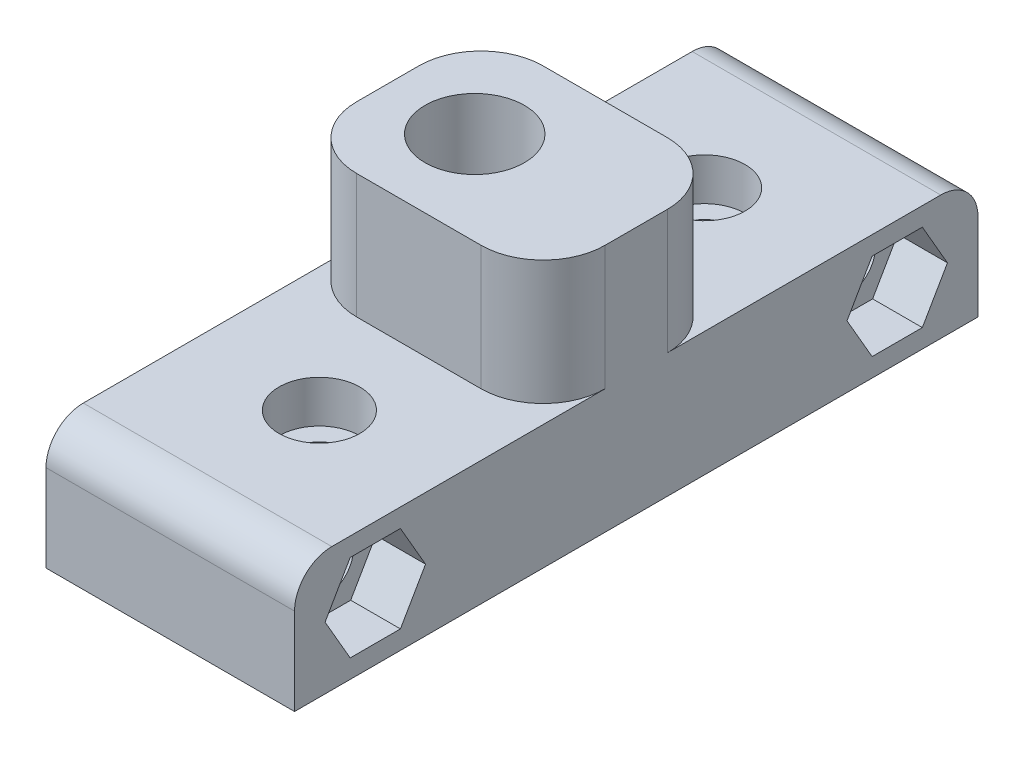
ISO-10303-21;
HEADER;
FILE_DESCRIPTION(('STEP AP214'),'2;1');
FILE_NAME('part.step','',(''),(''),'','','');
FILE_SCHEMA(('AUTOMOTIVE_DESIGN { 1 0 10303 214 1 1 1 1 }'));
ENDSEC;
DATA;
#1=APPLICATION_CONTEXT('core data for automotive mechanical design processes');
#2=APPLICATION_PROTOCOL_DEFINITION('international standard','automotive_design',2000,#1);
#3=PRODUCT_CONTEXT('',#1,'mechanical');
#4=PRODUCT('Part','Part','',(#3));
#5=PRODUCT_RELATED_PRODUCT_CATEGORY('part','',(#4));
#6=PRODUCT_DEFINITION_FORMATION('','',#4);
#7=PRODUCT_DEFINITION_CONTEXT('part definition',#1,'design');
#8=PRODUCT_DEFINITION('design','',#6,#7);
#9=PRODUCT_DEFINITION_SHAPE('','',#8);
#10=(LENGTH_UNIT() NAMED_UNIT(*) SI_UNIT(.MILLI.,.METRE.));
#11=(NAMED_UNIT(*) PLANE_ANGLE_UNIT() SI_UNIT($,.RADIAN.));
#12=(NAMED_UNIT(*) SI_UNIT($,.STERADIAN.) SOLID_ANGLE_UNIT());
#13=UNCERTAINTY_MEASURE_WITH_UNIT(LENGTH_MEASURE(1.E-05),#10,'distance_accuracy_value','');
#14=(GEOMETRIC_REPRESENTATION_CONTEXT(3) GLOBAL_UNCERTAINTY_ASSIGNED_CONTEXT((#13)) GLOBAL_UNIT_ASSIGNED_CONTEXT((#10,
#11,#12)) REPRESENTATION_CONTEXT('',''));
#15=CARTESIAN_POINT('',(0.,0.,0.));
#16=DIRECTION('',(0.,0.,1.));
#17=DIRECTION('',(1.,0.,0.));
#18=AXIS2_PLACEMENT_3D('',#15,#16,#17);
#19=CARTESIAN_POINT('',(10.,5.,21.));
#20=DIRECTION('',(-1.,0.,0.));
#21=DIRECTION('',(0.,0.,1.));
#22=AXIS2_PLACEMENT_3D('',#19,#20,#21);
#23=CYLINDRICAL_SURFACE('',#22,2.25);
#24=CARTESIAN_POINT('',(-10.,5.,21.));
#25=DIRECTION('',(-1.,0.,0.));
#26=DIRECTION('',(0.,0.,1.));
#27=AXIS2_PLACEMENT_3D('',#24,#25,#26);
#28=CIRCLE('',#27,2.25);
#29=CARTESIAN_POINT('',(-10.,5.,23.25));
#30=VERTEX_POINT('',#29);
#31=EDGE_CURVE('E361',#30,#30,#28,.T.);
#32=ORIENTED_EDGE('',*,*,#31,.T.);
#33=EDGE_LOOP('',(#32));
#34=FACE_BOUND('',#33,.T.);
#35=CARTESIAN_POINT('',(6.,5.,21.));
#36=DIRECTION('',(1.,0.,0.));
#37=DIRECTION('',(0.,0.,-1.));
#38=AXIS2_PLACEMENT_3D('',#35,#36,#37);
#39=CIRCLE('',#38,2.25);
#40=CARTESIAN_POINT('',(6.,5.,18.75));
#41=VERTEX_POINT('',#40);
#42=EDGE_CURVE('E365',#41,#41,#39,.F.);
#43=ORIENTED_EDGE('',*,*,#42,.F.);
#44=EDGE_LOOP('',(#43));
#45=FACE_BOUND('',#44,.T.);
#46=ADVANCED_FACE('F39',(#34,#45),#23,.F.);
#47=CARTESIAN_POINT('',(10.,5.,-21.));
#48=DIRECTION('',(-1.,0.,0.));
#49=DIRECTION('',(0.,0.,1.));
#50=AXIS2_PLACEMENT_3D('',#47,#48,#49);
#51=CYLINDRICAL_SURFACE('',#50,2.25);
#52=CARTESIAN_POINT('',(-10.,5.,-21.));
#53=DIRECTION('',(-1.,0.,0.));
#54=DIRECTION('',(0.,0.,1.));
#55=AXIS2_PLACEMENT_3D('',#52,#53,#54);
#56=CIRCLE('',#55,2.25);
#57=CARTESIAN_POINT('',(-10.,5.,-18.75));
#58=VERTEX_POINT('',#57);
#59=EDGE_CURVE('E356',#58,#58,#56,.T.);
#60=ORIENTED_EDGE('',*,*,#59,.T.);
#61=EDGE_LOOP('',(#60));
#62=FACE_BOUND('',#61,.T.);
#63=CARTESIAN_POINT('',(6.,5.,-21.));
#64=DIRECTION('',(1.,0.,0.));
#65=DIRECTION('',(0.,0.,-1.));
#66=AXIS2_PLACEMENT_3D('',#63,#64,#65);
#67=CIRCLE('',#66,2.25);
#68=CARTESIAN_POINT('',(6.,5.,-23.25));
#69=VERTEX_POINT('',#68);
#70=EDGE_CURVE('E279',#69,#69,#67,.F.);
#71=ORIENTED_EDGE('',*,*,#70,.F.);
#72=EDGE_LOOP('',(#71));
#73=FACE_BOUND('',#72,.T.);
#74=ADVANCED_FACE('F611',(#62,#73),#51,.F.);
#75=CARTESIAN_POINT('',(-10.,20.,-27.5));
#76=DIRECTION('',(0.,0.,1.));
#77=DIRECTION('',(1.,0.,0.));
#78=AXIS2_PLACEMENT_3D('',#75,#76,#77);
#79=PLANE('',#78);
#80=DIRECTION('',(0.,-1.,0.));
#81=VECTOR('',#80,1.);
#82=CARTESIAN_POINT('',(-10.,20.,-27.5));
#83=LINE('',#82,#81);
#84=CARTESIAN_POINT('',(-10.,7.,-27.5));
#85=VERTEX_POINT('',#84);
#86=CARTESIAN_POINT('',(-10.,0.,-27.5));
#87=VERTEX_POINT('',#86);
#88=EDGE_CURVE('E465',#85,#87,#83,.T.);
#89=ORIENTED_EDGE('',*,*,#88,.F.);
#90=DIRECTION('',(-1.,0.,0.));
#91=VECTOR('',#90,1.);
#92=CARTESIAN_POINT('',(10.,7.,-27.5));
#93=LINE('',#92,#91);
#94=CARTESIAN_POINT('',(10.,7.,-27.5));
#95=VERTEX_POINT('',#94);
#96=EDGE_CURVE('E11',#85,#95,#93,.F.);
#97=ORIENTED_EDGE('',*,*,#96,.T.);
#98=DIRECTION('',(0.,-1.,0.));
#99=VECTOR('',#98,1.);
#100=CARTESIAN_POINT('',(10.,20.,-27.5));
#101=LINE('',#100,#99);
#102=CARTESIAN_POINT('',(10.,0.,-27.5));
#103=VERTEX_POINT('',#102);
#104=EDGE_CURVE('E468',#95,#103,#101,.T.);
#105=ORIENTED_EDGE('',*,*,#104,.T.);
#106=DIRECTION('',(-1.,0.,0.));
#107=VECTOR('',#106,1.);
#108=CARTESIAN_POINT('',(-10.,0.,-27.5));
#109=LINE('',#108,#107);
#110=EDGE_CURVE('E449',#103,#87,#109,.T.);
#111=ORIENTED_EDGE('',*,*,#110,.T.);
#112=EDGE_LOOP('',(#89,#97,#105,#111));
#113=FACE_BOUND('',#112,.T.);
#114=ADVANCED_FACE('F609',(#113),#79,.F.);
#115=CARTESIAN_POINT('',(10.,20.,27.5));
#116=DIRECTION('',(-1.,0.,0.));
#117=DIRECTION('',(0.,0.,1.));
#118=AXIS2_PLACEMENT_3D('',#115,#116,#117);
#119=PLANE('',#118);
#120=DIRECTION('',(0.,0.866025403784438,0.5));
#121=VECTOR('',#120,1.);
#122=CARTESIAN_POINT('',(10.,5.,16.9585481156726));
#123=LINE('',#122,#121);
#124=CARTESIAN_POINT('',(10.,5.,16.9585481156726));
#125=VERTEX_POINT('',#124);
#126=CARTESIAN_POINT('',(10.,8.5,18.9792740578363));
#127=VERTEX_POINT('',#126);
#128=EDGE_CURVE('E261',#125,#127,#123,.T.);
#129=ORIENTED_EDGE('',*,*,#128,.F.);
#130=DIRECTION('',(0.,0.866025403784439,-0.5));
#131=VECTOR('',#130,1.);
#132=CARTESIAN_POINT('',(10.,1.49999999999999,18.9792740578363));
#133=LINE('',#132,#131);
#134=CARTESIAN_POINT('',(10.,1.49999999999999,18.9792740578363));
#135=VERTEX_POINT('',#134);
#136=EDGE_CURVE('E219',#135,#125,#133,.T.);
#137=ORIENTED_EDGE('',*,*,#136,.F.);
#138=DIRECTION('',(0.,0.,-1.));
#139=VECTOR('',#138,1.);
#140=CARTESIAN_POINT('',(10.,1.49999999999999,23.0207259421637));
#141=LINE('',#140,#139);
#142=CARTESIAN_POINT('',(10.,1.49999999999999,23.0207259421637));
#143=VERTEX_POINT('',#142);
#144=EDGE_CURVE('E241',#143,#135,#141,.T.);
#145=ORIENTED_EDGE('',*,*,#144,.F.);
#146=DIRECTION('',(0.,-0.866025403784438,-0.5));
#147=VECTOR('',#146,1.);
#148=CARTESIAN_POINT('',(10.,5.,25.0414518843274));
#149=LINE('',#148,#147);
#150=CARTESIAN_POINT('',(10.,5.,25.0414518843274));
#151=VERTEX_POINT('',#150);
#152=EDGE_CURVE('E245',#151,#143,#149,.T.);
#153=ORIENTED_EDGE('',*,*,#152,.F.);
#154=DIRECTION('',(0.,-0.866025403784439,0.5));
#155=VECTOR('',#154,1.);
#156=CARTESIAN_POINT('',(10.,8.5,23.0207259421637));
#157=LINE('',#156,#155);
#158=CARTESIAN_POINT('',(10.,8.5,23.0207259421637));
#159=VERTEX_POINT('',#158);
#160=EDGE_CURVE('E269',#159,#151,#157,.T.);
#161=ORIENTED_EDGE('',*,*,#160,.F.);
#162=DIRECTION('',(0.,0.,1.));
#163=VECTOR('',#162,1.);
#164=CARTESIAN_POINT('',(10.,8.5,18.9792740578363));
#165=LINE('',#164,#163);
#166=EDGE_CURVE('E265',#127,#159,#165,.T.);
#167=ORIENTED_EDGE('',*,*,#166,.F.);
#168=EDGE_LOOP('',(#129,#137,#145,#153,#161,#167));
#169=FACE_BOUND('',#168,.T.);
#170=DIRECTION('',(0.,-0.866025403784438,-0.5));
#171=VECTOR('',#170,1.);
#172=CARTESIAN_POINT('',(10.,5.,-16.9585481156726));
#173=LINE('',#172,#171);
#174=CARTESIAN_POINT('',(10.,5.,-16.9585481156726));
#175=VERTEX_POINT('',#174);
#176=CARTESIAN_POINT('',(10.,1.5,-18.9792740578363));
#177=VERTEX_POINT('',#176);
#178=EDGE_CURVE('E320',#175,#177,#173,.T.);
#179=ORIENTED_EDGE('',*,*,#178,.F.);
#180=DIRECTION('',(0.,-0.866025403784439,0.5));
#181=VECTOR('',#180,1.);
#182=CARTESIAN_POINT('',(10.,8.5,-18.9792740578363));
#183=LINE('',#182,#181);
#184=CARTESIAN_POINT('',(10.,8.5,-18.9792740578363));
#185=VERTEX_POINT('',#184);
#186=EDGE_CURVE('E317',#185,#175,#183,.T.);
#187=ORIENTED_EDGE('',*,*,#186,.F.);
#188=DIRECTION('',(0.,0.,1.));
#189=VECTOR('',#188,1.);
#190=CARTESIAN_POINT('',(10.,8.5,-23.0207259421637));
#191=LINE('',#190,#189);
#192=CARTESIAN_POINT('',(10.,8.5,-23.0207259421637));
#193=VERTEX_POINT('',#192);
#194=EDGE_CURVE('E296',#193,#185,#191,.T.);
#195=ORIENTED_EDGE('',*,*,#194,.F.);
#196=DIRECTION('',(0.,0.866025403784439,0.5));
#197=VECTOR('',#196,1.);
#198=CARTESIAN_POINT('',(10.,5.,-25.0414518843274));
#199=LINE('',#198,#197);
#200=CARTESIAN_POINT('',(10.,5.,-25.0414518843274));
#201=VERTEX_POINT('',#200);
#202=EDGE_CURVE('E332',#201,#193,#199,.T.);
#203=ORIENTED_EDGE('',*,*,#202,.F.);
#204=DIRECTION('',(0.,0.866025403784439,-0.499999999999999));
#205=VECTOR('',#204,1.);
#206=CARTESIAN_POINT('',(10.,1.5,-23.0207259421637));
#207=LINE('',#206,#205);
#208=CARTESIAN_POINT('',(10.,1.5,-23.0207259421637));
#209=VERTEX_POINT('',#208);
#210=EDGE_CURVE('E328',#209,#201,#207,.T.);
#211=ORIENTED_EDGE('',*,*,#210,.F.);
#212=DIRECTION('',(0.,0.,-1.));
#213=VECTOR('',#212,1.);
#214=CARTESIAN_POINT('',(10.,1.5,-18.9792740578363));
#215=LINE('',#214,#213);
#216=EDGE_CURVE('E324',#177,#209,#215,.T.);
#217=ORIENTED_EDGE('',*,*,#216,.F.);
#218=EDGE_LOOP('',(#179,#187,#195,#203,#211,#217));
#219=FACE_BOUND('',#218,.T.);
#220=DIRECTION('',(0.,0.,-1.));
#221=VECTOR('',#220,1.);
#222=CARTESIAN_POINT('',(10.,10.,27.5));
#223=LINE('',#222,#221);
#224=CARTESIAN_POINT('',(10.,10.,24.5));
#225=VERTEX_POINT('',#224);
#226=CARTESIAN_POINT('',(10.,10.,2.5));
#227=VERTEX_POINT('',#226);
#228=EDGE_CURVE('E402',#225,#227,#223,.T.);
#229=ORIENTED_EDGE('',*,*,#228,.F.);
#230=CARTESIAN_POINT('',(10.,7.,24.5));
#231=DIRECTION('',(-1.,0.,0.));
#232=DIRECTION('',(0.,0.,1.));
#233=AXIS2_PLACEMENT_3D('',#230,#231,#232);
#234=CIRCLE('',#233,3.);
#235=CARTESIAN_POINT('',(10.,7.,27.5));
#236=VERTEX_POINT('',#235);
#237=EDGE_CURVE('E540',#225,#236,#234,.F.);
#238=ORIENTED_EDGE('',*,*,#237,.T.);
#239=DIRECTION('',(0.,-1.,0.));
#240=VECTOR('',#239,1.);
#241=CARTESIAN_POINT('',(10.,20.,27.5));
#242=LINE('',#241,#240);
#243=CARTESIAN_POINT('',(10.,0.,27.5));
#244=VERTEX_POINT('',#243);
#245=EDGE_CURVE('E445',#236,#244,#242,.T.);
#246=ORIENTED_EDGE('',*,*,#245,.T.);
#247=DIRECTION('',(0.,0.,-1.));
#248=VECTOR('',#247,1.);
#249=CARTESIAN_POINT('',(10.,0.,27.5));
#250=LINE('',#249,#248);
#251=EDGE_CURVE('E432',#244,#103,#250,.T.);
#252=ORIENTED_EDGE('',*,*,#251,.T.);
#253=ORIENTED_EDGE('',*,*,#104,.F.);
#254=CARTESIAN_POINT('',(10.,7.,-24.5));
#255=DIRECTION('',(-1.,0.,0.));
#256=DIRECTION('',(0.,0.,1.));
#257=AXIS2_PLACEMENT_3D('',#254,#255,#256);
#258=CIRCLE('',#257,3.);
#259=CARTESIAN_POINT('',(10.,10.,-24.5));
#260=VERTEX_POINT('',#259);
#261=EDGE_CURVE('E537',#95,#260,#258,.F.);
#262=ORIENTED_EDGE('',*,*,#261,.T.);
#263=DIRECTION('',(0.,0.,-1.));
#264=VECTOR('',#263,1.);
#265=CARTESIAN_POINT('',(10.,10.,-27.5));
#266=LINE('',#265,#264);
#267=CARTESIAN_POINT('',(10.,10.,-2.50000000000001));
#268=VERTEX_POINT('',#267);
#269=EDGE_CURVE('E414',#268,#260,#266,.T.);
#270=ORIENTED_EDGE('',*,*,#269,.F.);
#271=DIRECTION('',(0.,1.,0.));
#272=VECTOR('',#271,1.);
#273=CARTESIAN_POINT('',(10.,20.,-2.50000000000001));
#274=LINE('',#273,#272);
#275=CARTESIAN_POINT('',(10.,20.,-2.50000000000001));
#276=VERTEX_POINT('',#275);
#277=EDGE_CURVE('E509',#268,#276,#274,.T.);
#278=ORIENTED_EDGE('',*,*,#277,.T.);
#279=DIRECTION('',(0.,0.,-1.));
#280=VECTOR('',#279,1.);
#281=CARTESIAN_POINT('',(10.,20.,27.5));
#282=LINE('',#281,#280);
#283=CARTESIAN_POINT('',(10.,20.,2.5));
#284=VERTEX_POINT('',#283);
#285=EDGE_CURVE('E436',#284,#276,#282,.T.);
#286=ORIENTED_EDGE('',*,*,#285,.F.);
#287=DIRECTION('',(0.,1.,0.));
#288=VECTOR('',#287,1.);
#289=CARTESIAN_POINT('',(10.,20.,2.5));
#290=LINE('',#289,#288);
#291=EDGE_CURVE('E505',#284,#227,#290,.F.);
#292=ORIENTED_EDGE('',*,*,#291,.T.);
#293=EDGE_LOOP('',(#229,#238,#246,#252,#253,#262,#270,#278,#286,#292));
#294=FACE_BOUND('',#293,.T.);
#295=ADVANCED_FACE('F574',(#169,#219,#294),#119,.F.);
#296=CARTESIAN_POINT('',(-10.,20.,27.5));
#297=DIRECTION('',(1.,0.,0.));
#298=DIRECTION('',(0.,0.,-1.));
#299=AXIS2_PLACEMENT_3D('',#296,#297,#298);
#300=PLANE('',#299);
#301=ORIENTED_EDGE('',*,*,#59,.F.);
#302=EDGE_LOOP('',(#301));
#303=FACE_BOUND('',#302,.T.);
#304=ORIENTED_EDGE('',*,*,#31,.F.);
#305=EDGE_LOOP('',(#304));
#306=FACE_BOUND('',#305,.T.);
#307=DIRECTION('',(0.,-1.,0.));
#308=VECTOR('',#307,1.);
#309=CARTESIAN_POINT('',(-10.,20.,27.5));
#310=LINE('',#309,#308);
#311=CARTESIAN_POINT('',(-10.,7.,27.5));
#312=VERTEX_POINT('',#311);
#313=CARTESIAN_POINT('',(-10.,0.,27.5));
#314=VERTEX_POINT('',#313);
#315=EDGE_CURVE('E462',#312,#314,#310,.T.);
#316=ORIENTED_EDGE('',*,*,#315,.F.);
#317=CARTESIAN_POINT('',(-10.,7.,24.5));
#318=DIRECTION('',(1.,0.,0.));
#319=DIRECTION('',(0.,0.,-1.));
#320=AXIS2_PLACEMENT_3D('',#317,#318,#319);
#321=CIRCLE('',#320,3.);
#322=CARTESIAN_POINT('',(-10.,10.,24.5));
#323=VERTEX_POINT('',#322);
#324=EDGE_CURVE('E548',#312,#323,#321,.F.);
#325=ORIENTED_EDGE('',*,*,#324,.T.);
#326=DIRECTION('',(0.,0.,1.));
#327=VECTOR('',#326,1.);
#328=CARTESIAN_POINT('',(-10.,10.,27.5));
#329=LINE('',#328,#327);
#330=CARTESIAN_POINT('',(-10.,10.,2.5));
#331=VERTEX_POINT('',#330);
#332=EDGE_CURVE('E398',#331,#323,#329,.T.);
#333=ORIENTED_EDGE('',*,*,#332,.F.);
#334=DIRECTION('',(0.,1.,0.));
#335=VECTOR('',#334,1.);
#336=CARTESIAN_POINT('',(-10.,20.,2.5));
#337=LINE('',#336,#335);
#338=CARTESIAN_POINT('',(-10.,20.,2.5));
#339=VERTEX_POINT('',#338);
#340=EDGE_CURVE('E490',#331,#339,#337,.T.);
#341=ORIENTED_EDGE('',*,*,#340,.T.);
#342=DIRECTION('',(0.,0.,1.));
#343=VECTOR('',#342,1.);
#344=CARTESIAN_POINT('',(-10.,20.,27.5));
#345=LINE('',#344,#343);
#346=CARTESIAN_POINT('',(-10.,20.,-2.50000000000001));
#347=VERTEX_POINT('',#346);
#348=EDGE_CURVE('E440',#347,#339,#345,.T.);
#349=ORIENTED_EDGE('',*,*,#348,.F.);
#350=DIRECTION('',(0.,1.,0.));
#351=VECTOR('',#350,1.);
#352=CARTESIAN_POINT('',(-10.,20.,-2.50000000000001));
#353=LINE('',#352,#351);
#354=CARTESIAN_POINT('',(-10.,10.,-2.50000000000001));
#355=VERTEX_POINT('',#354);
#356=EDGE_CURVE('E494',#347,#355,#353,.F.);
#357=ORIENTED_EDGE('',*,*,#356,.T.);
#358=DIRECTION('',(0.,0.,1.));
#359=VECTOR('',#358,1.);
#360=CARTESIAN_POINT('',(-10.,10.,-27.5));
#361=LINE('',#360,#359);
#362=CARTESIAN_POINT('',(-10.,10.,-24.5));
#363=VERTEX_POINT('',#362);
#364=EDGE_CURVE('E415',#363,#355,#361,.T.);
#365=ORIENTED_EDGE('',*,*,#364,.F.);
#366=CARTESIAN_POINT('',(-10.,7.,-24.5));
#367=DIRECTION('',(1.,0.,0.));
#368=DIRECTION('',(0.,0.,-1.));
#369=AXIS2_PLACEMENT_3D('',#366,#367,#368);
#370=CIRCLE('',#369,3.);
#371=EDGE_CURVE('E55',#363,#85,#370,.F.);
#372=ORIENTED_EDGE('',*,*,#371,.T.);
#373=ORIENTED_EDGE('',*,*,#88,.T.);
#374=DIRECTION('',(0.,0.,1.));
#375=VECTOR('',#374,1.);
#376=CARTESIAN_POINT('',(-10.,0.,27.5));
#377=LINE('',#376,#375);
#378=EDGE_CURVE('E453',#87,#314,#377,.T.);
#379=ORIENTED_EDGE('',*,*,#378,.T.);
#380=EDGE_LOOP('',(#316,#325,#333,#341,#349,#357,#365,#372,#373,#379));
#381=FACE_BOUND('',#380,.T.);
#382=ADVANCED_FACE('F555',(#303,#306,#381),#300,.F.);
#383=CARTESIAN_POINT('',(-10.,20.,27.5));
#384=DIRECTION('',(0.,0.,-1.));
#385=DIRECTION('',(-1.,0.,0.));
#386=AXIS2_PLACEMENT_3D('',#383,#384,#385);
#387=PLANE('',#386);
#388=ORIENTED_EDGE('',*,*,#245,.F.);
#389=DIRECTION('',(1.,0.,0.));
#390=VECTOR('',#389,1.);
#391=CARTESIAN_POINT('',(-10.,7.,27.5));
#392=LINE('',#391,#390);
#393=EDGE_CURVE('E543',#236,#312,#392,.F.);
#394=ORIENTED_EDGE('',*,*,#393,.T.);
#395=ORIENTED_EDGE('',*,*,#315,.T.);
#396=DIRECTION('',(1.,0.,0.));
#397=VECTOR('',#396,1.);
#398=CARTESIAN_POINT('',(-10.,0.,27.5));
#399=LINE('',#398,#397);
#400=EDGE_CURVE('E441',#314,#244,#399,.T.);
#401=ORIENTED_EDGE('',*,*,#400,.T.);
#402=EDGE_LOOP('',(#388,#394,#395,#401));
#403=FACE_BOUND('',#402,.T.);
#404=ADVANCED_FACE('F600',(#403),#387,.F.);
#405=CARTESIAN_POINT('',(0.,20.,0.));
#406=DIRECTION('',(0.,-1.,0.));
#407=DIRECTION('',(0.,0.,-1.));
#408=AXIS2_PLACEMENT_3D('',#405,#406,#407);
#409=PLANE('',#408);
#410=CARTESIAN_POINT('',(-3.,20.,0.));
#411=DIRECTION('',(0.,1.,0.));
#412=DIRECTION('',(0.,0.,1.));
#413=AXIS2_PLACEMENT_3D('',#410,#411,#412);
#414=CIRCLE('',#413,4.);
#415=CARTESIAN_POINT('',(-3.,20.,4.));
#416=VERTEX_POINT('',#415);
#417=EDGE_CURVE('E410',#416,#416,#414,.T.);
#418=ORIENTED_EDGE('',*,*,#417,.F.);
#419=EDGE_LOOP('',(#418));
#420=FACE_BOUND('',#419,.T.);
#421=DIRECTION('',(1.,0.,0.));
#422=VECTOR('',#421,1.);
#423=CARTESIAN_POINT('',(-10.,20.,-7.50000000000001));
#424=LINE('',#423,#422);
#425=CARTESIAN_POINT('',(-5.,20.,-7.50000000000001));
#426=VERTEX_POINT('',#425);
#427=CARTESIAN_POINT('',(5.,20.,-7.50000000000001));
#428=VERTEX_POINT('',#427);
#429=EDGE_CURVE('E397',#426,#428,#424,.T.);
#430=ORIENTED_EDGE('',*,*,#429,.F.);
#431=CARTESIAN_POINT('',(-5.,20.,-2.50000000000001));
#432=DIRECTION('',(0.,-1.,0.));
#433=DIRECTION('',(0.,0.,-1.));
#434=AXIS2_PLACEMENT_3D('',#431,#432,#433);
#435=CIRCLE('',#434,5.);
#436=EDGE_CURVE('E487',#426,#347,#435,.F.);
#437=ORIENTED_EDGE('',*,*,#436,.T.);
#438=ORIENTED_EDGE('',*,*,#348,.T.);
#439=CARTESIAN_POINT('',(-5.,20.,2.5));
#440=DIRECTION('',(0.,-1.,0.));
#441=DIRECTION('',(0.,0.,-1.));
#442=AXIS2_PLACEMENT_3D('',#439,#440,#441);
#443=CIRCLE('',#442,5.);
#444=CARTESIAN_POINT('',(-5.,20.,7.5));
#445=VERTEX_POINT('',#444);
#446=EDGE_CURVE('E484',#339,#445,#443,.F.);
#447=ORIENTED_EDGE('',*,*,#446,.T.);
#448=DIRECTION('',(-1.,0.,0.));
#449=VECTOR('',#448,1.);
#450=CARTESIAN_POINT('',(-10.,20.,7.5));
#451=LINE('',#450,#449);
#452=CARTESIAN_POINT('',(5.,20.,7.5));
#453=VERTEX_POINT('',#452);
#454=EDGE_CURVE('E403',#453,#445,#451,.T.);
#455=ORIENTED_EDGE('',*,*,#454,.F.);
#456=CARTESIAN_POINT('',(5.,20.,2.5));
#457=DIRECTION('',(0.,-1.,0.));
#458=DIRECTION('',(0.,0.,-1.));
#459=AXIS2_PLACEMENT_3D('',#456,#457,#458);
#460=CIRCLE('',#459,5.);
#461=EDGE_CURVE('E478',#453,#284,#460,.F.);
#462=ORIENTED_EDGE('',*,*,#461,.T.);
#463=ORIENTED_EDGE('',*,*,#285,.T.);
#464=CARTESIAN_POINT('',(5.,20.,-2.50000000000001));
#465=DIRECTION('',(0.,-1.,0.));
#466=DIRECTION('',(0.,0.,-1.));
#467=AXIS2_PLACEMENT_3D('',#464,#465,#466);
#468=CIRCLE('',#467,5.);
#469=EDGE_CURVE('E481',#276,#428,#468,.F.);
#470=ORIENTED_EDGE('',*,*,#469,.T.);
#471=EDGE_LOOP('',(#430,#437,#438,#447,#455,#462,#463,#470));
#472=FACE_BOUND('',#471,.T.);
#473=ADVANCED_FACE('F577',(#420,#472),#409,.F.);
#474=CARTESIAN_POINT('',(0.,0.,0.));
#475=DIRECTION('',(0.,-1.,0.));
#476=DIRECTION('',(0.,0.,-1.));
#477=AXIS2_PLACEMENT_3D('',#474,#475,#476);
#478=PLANE('',#477);
#479=CARTESIAN_POINT('',(0.,0.,15.5));
#480=DIRECTION('',(0.,1.,0.));
#481=DIRECTION('',(0.,0.,1.));
#482=AXIS2_PLACEMENT_3D('',#479,#480,#481);
#483=CIRCLE('',#482,1.7);
#484=CARTESIAN_POINT('',(0.,0.,17.2));
#485=VERTEX_POINT('',#484);
#486=EDGE_CURVE('E377',#485,#485,#483,.T.);
#487=ORIENTED_EDGE('',*,*,#486,.T.);
#488=EDGE_LOOP('',(#487));
#489=FACE_BOUND('',#488,.T.);
#490=CARTESIAN_POINT('',(0.,0.,-15.5));
#491=DIRECTION('',(0.,1.,0.));
#492=DIRECTION('',(0.,0.,1.));
#493=AXIS2_PLACEMENT_3D('',#490,#491,#492);
#494=CIRCLE('',#493,1.7);
#495=CARTESIAN_POINT('',(0.,0.,-13.8));
#496=VERTEX_POINT('',#495);
#497=EDGE_CURVE('E393',#496,#496,#494,.T.);
#498=ORIENTED_EDGE('',*,*,#497,.T.);
#499=EDGE_LOOP('',(#498));
#500=FACE_BOUND('',#499,.T.);
#501=ORIENTED_EDGE('',*,*,#251,.F.);
#502=ORIENTED_EDGE('',*,*,#400,.F.);
#503=ORIENTED_EDGE('',*,*,#378,.F.);
#504=ORIENTED_EDGE('',*,*,#110,.F.);
#505=EDGE_LOOP('',(#501,#502,#503,#504));
#506=FACE_BOUND('',#505,.T.);
#507=ADVANCED_FACE('F606',(#489,#500,#506),#478,.T.);
#508=CARTESIAN_POINT('',(-3.,10.,0.));
#509=DIRECTION('',(0.,1.,0.));
#510=DIRECTION('',(0.,0.,1.));
#511=AXIS2_PLACEMENT_3D('',#508,#509,#510);
#512=CYLINDRICAL_SURFACE('',#511,4.);
#513=CARTESIAN_POINT('',(-3.,10.,0.));
#514=DIRECTION('',(0.,1.,0.));
#515=DIRECTION('',(0.,0.,1.));
#516=AXIS2_PLACEMENT_3D('',#513,#514,#515);
#517=CIRCLE('',#516,4.);
#518=CARTESIAN_POINT('',(-3.,10.,4.));
#519=VERTEX_POINT('',#518);
#520=EDGE_CURVE('E428',#519,#519,#517,.T.);
#521=ORIENTED_EDGE('',*,*,#520,.F.);
#522=EDGE_LOOP('',(#521));
#523=FACE_BOUND('',#522,.T.);
#524=ORIENTED_EDGE('',*,*,#417,.T.);
#525=EDGE_LOOP('',(#524));
#526=FACE_BOUND('',#525,.T.);
#527=ADVANCED_FACE('F669',(#523,#526),#512,.F.);
#528=CARTESIAN_POINT('',(-3.,10.,0.));
#529=DIRECTION('',(0.,1.,0.));
#530=DIRECTION('',(0.,0.,1.));
#531=AXIS2_PLACEMENT_3D('',#528,#529,#530);
#532=PLANE('',#531);
#533=ORIENTED_EDGE('',*,*,#520,.T.);
#534=EDGE_LOOP('',(#533));
#535=FACE_BOUND('',#534,.T.);
#536=ADVANCED_FACE('F666',(#535),#532,.T.);
#537=CARTESIAN_POINT('',(-10.,10.,-7.50000000000001));
#538=DIRECTION('',(0.,0.,1.));
#539=DIRECTION('',(1.,0.,0.));
#540=AXIS2_PLACEMENT_3D('',#537,#538,#539);
#541=PLANE('',#540);
#542=DIRECTION('',(1.,0.,0.));
#543=VECTOR('',#542,1.);
#544=CARTESIAN_POINT('',(-10.,10.,-7.50000000000001));
#545=LINE('',#544,#543);
#546=CARTESIAN_POINT('',(-5.,10.,-7.50000000000001));
#547=VERTEX_POINT('',#546);
#548=CARTESIAN_POINT('',(5.,10.,-7.50000000000001));
#549=VERTEX_POINT('',#548);
#550=EDGE_CURVE('E418',#547,#549,#545,.T.);
#551=ORIENTED_EDGE('',*,*,#550,.F.);
#552=DIRECTION('',(0.,1.,0.));
#553=VECTOR('',#552,1.);
#554=CARTESIAN_POINT('',(-5.,10.,-7.50000000000001));
#555=LINE('',#554,#553);
#556=EDGE_CURVE('E474',#547,#426,#555,.T.);
#557=ORIENTED_EDGE('',*,*,#556,.T.);
#558=ORIENTED_EDGE('',*,*,#429,.T.);
#559=DIRECTION('',(0.,1.,0.));
#560=VECTOR('',#559,1.);
#561=CARTESIAN_POINT('',(5.,10.,-7.50000000000001));
#562=LINE('',#561,#560);
#563=EDGE_CURVE('E471',#428,#549,#562,.F.);
#564=ORIENTED_EDGE('',*,*,#563,.T.);
#565=EDGE_LOOP('',(#551,#557,#558,#564));
#566=FACE_BOUND('',#565,.T.);
#567=ADVANCED_FACE('F565',(#566),#541,.F.);
#568=CARTESIAN_POINT('',(0.,10.,0.));
#569=DIRECTION('',(0.,1.,0.));
#570=DIRECTION('',(0.,0.,1.));
#571=AXIS2_PLACEMENT_3D('',#568,#569,#570);
#572=PLANE('',#571);
#573=CARTESIAN_POINT('',(0.,10.,-15.5));
#574=DIRECTION('',(0.,1.,0.));
#575=DIRECTION('',(0.,0.,1.));
#576=AXIS2_PLACEMENT_3D('',#573,#574,#575);
#577=CIRCLE('',#576,3.25);
#578=CARTESIAN_POINT('',(0.,10.,-12.25));
#579=VERTEX_POINT('',#578);
#580=EDGE_CURVE('E381',#579,#579,#577,.T.);
#581=ORIENTED_EDGE('',*,*,#580,.F.);
#582=EDGE_LOOP('',(#581));
#583=FACE_BOUND('',#582,.T.);
#584=ORIENTED_EDGE('',*,*,#269,.T.);
#585=DIRECTION('',(-1.,0.,0.));
#586=VECTOR('',#585,1.);
#587=CARTESIAN_POINT('',(-10.,10.,-24.5));
#588=LINE('',#587,#586);
#589=EDGE_CURVE('E48',#260,#363,#588,.T.);
#590=ORIENTED_EDGE('',*,*,#589,.T.);
#591=ORIENTED_EDGE('',*,*,#364,.T.);
#592=CARTESIAN_POINT('',(-5.,10.,-2.50000000000001));
#593=DIRECTION('',(0.,1.,0.));
#594=DIRECTION('',(0.,0.,1.));
#595=AXIS2_PLACEMENT_3D('',#592,#593,#594);
#596=CIRCLE('',#595,5.);
#597=EDGE_CURVE('E513',#355,#547,#596,.F.);
#598=ORIENTED_EDGE('',*,*,#597,.T.);
#599=ORIENTED_EDGE('',*,*,#550,.T.);
#600=CARTESIAN_POINT('',(5.,10.,-2.50000000000001));
#601=DIRECTION('',(0.,1.,0.));
#602=DIRECTION('',(0.,0.,1.));
#603=AXIS2_PLACEMENT_3D('',#600,#601,#602);
#604=CIRCLE('',#603,5.);
#605=EDGE_CURVE('E520',#549,#268,#604,.F.);
#606=ORIENTED_EDGE('',*,*,#605,.T.);
#607=EDGE_LOOP('',(#584,#590,#591,#598,#599,#606));
#608=FACE_BOUND('',#607,.T.);
#609=ADVANCED_FACE('F552',(#583,#608),#572,.T.);
#610=CARTESIAN_POINT('',(-10.,10.,7.5));
#611=DIRECTION('',(0.,0.,-1.));
#612=DIRECTION('',(-1.,0.,0.));
#613=AXIS2_PLACEMENT_3D('',#610,#611,#612);
#614=PLANE('',#613);
#615=ORIENTED_EDGE('',*,*,#454,.T.);
#616=DIRECTION('',(0.,1.,0.));
#617=VECTOR('',#616,1.);
#618=CARTESIAN_POINT('',(-5.,10.,7.5));
#619=LINE('',#618,#617);
#620=CARTESIAN_POINT('',(-5.,10.,7.5));
#621=VERTEX_POINT('',#620);
#622=EDGE_CURVE('E502',#445,#621,#619,.F.);
#623=ORIENTED_EDGE('',*,*,#622,.T.);
#624=DIRECTION('',(-1.,0.,0.));
#625=VECTOR('',#624,1.);
#626=CARTESIAN_POINT('',(-10.,10.,7.5));
#627=LINE('',#626,#625);
#628=CARTESIAN_POINT('',(5.,10.,7.5));
#629=VERTEX_POINT('',#628);
#630=EDGE_CURVE('E406',#629,#621,#627,.T.);
#631=ORIENTED_EDGE('',*,*,#630,.F.);
#632=DIRECTION('',(0.,1.,0.));
#633=VECTOR('',#632,1.);
#634=CARTESIAN_POINT('',(5.,10.,7.5));
#635=LINE('',#634,#633);
#636=EDGE_CURVE('E498',#629,#453,#635,.T.);
#637=ORIENTED_EDGE('',*,*,#636,.T.);
#638=EDGE_LOOP('',(#615,#623,#631,#637));
#639=FACE_BOUND('',#638,.T.);
#640=ADVANCED_FACE('F585',(#639),#614,.F.);
#641=CARTESIAN_POINT('',(0.,10.,0.));
#642=DIRECTION('',(0.,-1.,0.));
#643=DIRECTION('',(0.,0.,-1.));
#644=AXIS2_PLACEMENT_3D('',#641,#642,#643);
#645=PLANE('',#644);
#646=CARTESIAN_POINT('',(0.,10.,15.5));
#647=DIRECTION('',(0.,1.,0.));
#648=DIRECTION('',(0.,0.,1.));
#649=AXIS2_PLACEMENT_3D('',#646,#647,#648);
#650=CIRCLE('',#649,3.25);
#651=CARTESIAN_POINT('',(0.,10.,18.75));
#652=VERTEX_POINT('',#651);
#653=EDGE_CURVE('E360',#652,#652,#650,.T.);
#654=ORIENTED_EDGE('',*,*,#653,.F.);
#655=EDGE_LOOP('',(#654));
#656=FACE_BOUND('',#655,.T.);
#657=ORIENTED_EDGE('',*,*,#332,.T.);
#658=DIRECTION('',(1.,0.,0.));
#659=VECTOR('',#658,1.);
#660=CARTESIAN_POINT('',(0.,10.,24.5));
#661=LINE('',#660,#659);
#662=EDGE_CURVE('E527',#323,#225,#661,.T.);
#663=ORIENTED_EDGE('',*,*,#662,.T.);
#664=ORIENTED_EDGE('',*,*,#228,.T.);
#665=CARTESIAN_POINT('',(5.,10.,2.5));
#666=DIRECTION('',(0.,-1.,0.));
#667=DIRECTION('',(0.,0.,-1.));
#668=AXIS2_PLACEMENT_3D('',#665,#666,#667);
#669=CIRCLE('',#668,5.);
#670=EDGE_CURVE('E524',#227,#629,#669,.T.);
#671=ORIENTED_EDGE('',*,*,#670,.T.);
#672=ORIENTED_EDGE('',*,*,#630,.T.);
#673=CARTESIAN_POINT('',(-5.,10.,2.5));
#674=DIRECTION('',(0.,-1.,0.));
#675=DIRECTION('',(0.,0.,-1.));
#676=AXIS2_PLACEMENT_3D('',#673,#674,#675);
#677=CIRCLE('',#676,5.);
#678=EDGE_CURVE('E516',#621,#331,#677,.T.);
#679=ORIENTED_EDGE('',*,*,#678,.T.);
#680=EDGE_LOOP('',(#657,#663,#664,#671,#672,#679));
#681=FACE_BOUND('',#680,.T.);
#682=ADVANCED_FACE('F589',(#656,#681),#645,.F.);
#683=CARTESIAN_POINT('',(0.,10.,-15.5));
#684=DIRECTION('',(0.,1.,0.));
#685=DIRECTION('',(0.,0.,1.));
#686=AXIS2_PLACEMENT_3D('',#683,#684,#685);
#687=CYLINDRICAL_SURFACE('',#686,1.70000000000001);
#688=ORIENTED_EDGE('',*,*,#497,.F.);
#689=EDGE_LOOP('',(#688));
#690=FACE_BOUND('',#689,.T.);
#691=CARTESIAN_POINT('',(0.,6.6,-15.5));
#692=DIRECTION('',(0.,1.,0.));
#693=DIRECTION('',(0.,0.,1.));
#694=AXIS2_PLACEMENT_3D('',#691,#692,#693);
#695=CIRCLE('',#694,1.70000000000001);
#696=CARTESIAN_POINT('',(0.,6.6,-13.8));
#697=VERTEX_POINT('',#696);
#698=EDGE_CURVE('E389',#697,#697,#695,.T.);
#699=ORIENTED_EDGE('',*,*,#698,.T.);
#700=EDGE_LOOP('',(#699));
#701=FACE_BOUND('',#700,.T.);
#702=ADVANCED_FACE('F651',(#690,#701),#687,.F.);
#703=CARTESIAN_POINT('',(1.70000000000001,6.6,-15.5));
#704=DIRECTION('',(0.,-1.,0.));
#705=DIRECTION('',(0.,0.,-1.));
#706=AXIS2_PLACEMENT_3D('',#703,#704,#705);
#707=PLANE('',#706);
#708=ORIENTED_EDGE('',*,*,#698,.F.);
#709=EDGE_LOOP('',(#708));
#710=FACE_BOUND('',#709,.T.);
#711=CARTESIAN_POINT('',(0.,6.6,-15.5));
#712=DIRECTION('',(0.,1.,0.));
#713=DIRECTION('',(0.,0.,1.));
#714=AXIS2_PLACEMENT_3D('',#711,#712,#713);
#715=CIRCLE('',#714,3.25);
#716=CARTESIAN_POINT('',(0.,6.6,-12.25));
#717=VERTEX_POINT('',#716);
#718=EDGE_CURVE('E385',#717,#717,#715,.T.);
#719=ORIENTED_EDGE('',*,*,#718,.T.);
#720=EDGE_LOOP('',(#719));
#721=FACE_BOUND('',#720,.T.);
#722=ADVANCED_FACE('F647',(#710,#721),#707,.F.);
#723=CARTESIAN_POINT('',(0.,10.,-15.5));
#724=DIRECTION('',(0.,1.,0.));
#725=DIRECTION('',(0.,0.,1.));
#726=AXIS2_PLACEMENT_3D('',#723,#724,#725);
#727=CYLINDRICAL_SURFACE('',#726,3.25);
#728=ORIENTED_EDGE('',*,*,#718,.F.);
#729=EDGE_LOOP('',(#728));
#730=FACE_BOUND('',#729,.T.);
#731=ORIENTED_EDGE('',*,*,#580,.T.);
#732=EDGE_LOOP('',(#731));
#733=FACE_BOUND('',#732,.T.);
#734=ADVANCED_FACE('F643',(#730,#733),#727,.F.);
#735=CARTESIAN_POINT('',(0.,10.,15.5));
#736=DIRECTION('',(0.,1.,0.));
#737=DIRECTION('',(0.,0.,1.));
#738=AXIS2_PLACEMENT_3D('',#735,#736,#737);
#739=CYLINDRICAL_SURFACE('',#738,1.70000000000001);
#740=ORIENTED_EDGE('',*,*,#486,.F.);
#741=EDGE_LOOP('',(#740));
#742=FACE_BOUND('',#741,.T.);
#743=CARTESIAN_POINT('',(0.,6.6,15.5));
#744=DIRECTION('',(0.,1.,0.));
#745=DIRECTION('',(0.,0.,1.));
#746=AXIS2_PLACEMENT_3D('',#743,#744,#745);
#747=CIRCLE('',#746,1.70000000000001);
#748=CARTESIAN_POINT('',(0.,6.6,17.2));
#749=VERTEX_POINT('',#748);
#750=EDGE_CURVE('E373',#749,#749,#747,.T.);
#751=ORIENTED_EDGE('',*,*,#750,.T.);
#752=EDGE_LOOP('',(#751));
#753=FACE_BOUND('',#752,.T.);
#754=ADVANCED_FACE('F639',(#742,#753),#739,.F.);
#755=CARTESIAN_POINT('',(1.70000000000001,6.6,15.5));
#756=DIRECTION('',(0.,-1.,0.));
#757=DIRECTION('',(0.,0.,-1.));
#758=AXIS2_PLACEMENT_3D('',#755,#756,#757);
#759=PLANE('',#758);
#760=ORIENTED_EDGE('',*,*,#750,.F.);
#761=EDGE_LOOP('',(#760));
#762=FACE_BOUND('',#761,.T.);
#763=CARTESIAN_POINT('',(0.,6.6,15.5));
#764=DIRECTION('',(0.,1.,0.));
#765=DIRECTION('',(0.,0.,1.));
#766=AXIS2_PLACEMENT_3D('',#763,#764,#765);
#767=CIRCLE('',#766,3.25);
#768=CARTESIAN_POINT('',(0.,6.6,18.75));
#769=VERTEX_POINT('',#768);
#770=EDGE_CURVE('E369',#769,#769,#767,.T.);
#771=ORIENTED_EDGE('',*,*,#770,.T.);
#772=EDGE_LOOP('',(#771));
#773=FACE_BOUND('',#772,.T.);
#774=ADVANCED_FACE('F635',(#762,#773),#759,.F.);
#775=CARTESIAN_POINT('',(0.,10.,15.5));
#776=DIRECTION('',(0.,1.,0.));
#777=DIRECTION('',(0.,0.,1.));
#778=AXIS2_PLACEMENT_3D('',#775,#776,#777);
#779=CYLINDRICAL_SURFACE('',#778,3.25);
#780=ORIENTED_EDGE('',*,*,#770,.F.);
#781=EDGE_LOOP('',(#780));
#782=FACE_BOUND('',#781,.T.);
#783=ORIENTED_EDGE('',*,*,#653,.T.);
#784=EDGE_LOOP('',(#783));
#785=FACE_BOUND('',#784,.T.);
#786=ADVANCED_FACE('F632',(#782,#785),#779,.F.);
#787=CARTESIAN_POINT('',(-5.,10.,-2.50000000000001));
#788=DIRECTION('',(0.,1.,0.));
#789=DIRECTION('',(0.,0.,1.));
#790=AXIS2_PLACEMENT_3D('',#787,#788,#789);
#791=CYLINDRICAL_SURFACE('',#790,5.);
#792=ORIENTED_EDGE('',*,*,#597,.F.);
#793=ORIENTED_EDGE('',*,*,#356,.F.);
#794=ORIENTED_EDGE('',*,*,#436,.F.);
#795=ORIENTED_EDGE('',*,*,#556,.F.);
#796=EDGE_LOOP('',(#792,#793,#794,#795));
#797=FACE_BOUND('',#796,.T.);
#798=ADVANCED_FACE('F561',(#797),#791,.T.);
#799=CARTESIAN_POINT('',(-5.,20.,2.5));
#800=DIRECTION('',(0.,1.,0.));
#801=DIRECTION('',(0.,0.,1.));
#802=AXIS2_PLACEMENT_3D('',#799,#800,#801);
#803=CYLINDRICAL_SURFACE('',#802,5.);
#804=ORIENTED_EDGE('',*,*,#678,.F.);
#805=ORIENTED_EDGE('',*,*,#622,.F.);
#806=ORIENTED_EDGE('',*,*,#446,.F.);
#807=ORIENTED_EDGE('',*,*,#340,.F.);
#808=EDGE_LOOP('',(#804,#805,#806,#807));
#809=FACE_BOUND('',#808,.T.);
#810=ADVANCED_FACE('F592',(#809),#803,.T.);
#811=CARTESIAN_POINT('',(5.,20.,-2.50000000000001));
#812=DIRECTION('',(0.,1.,0.));
#813=DIRECTION('',(0.,0.,1.));
#814=AXIS2_PLACEMENT_3D('',#811,#812,#813);
#815=CYLINDRICAL_SURFACE('',#814,5.);
#816=ORIENTED_EDGE('',*,*,#605,.F.);
#817=ORIENTED_EDGE('',*,*,#563,.F.);
#818=ORIENTED_EDGE('',*,*,#469,.F.);
#819=ORIENTED_EDGE('',*,*,#277,.F.);
#820=EDGE_LOOP('',(#816,#817,#818,#819));
#821=FACE_BOUND('',#820,.T.);
#822=ADVANCED_FACE('F569',(#821),#815,.T.);
#823=CARTESIAN_POINT('',(5.,10.,2.5));
#824=DIRECTION('',(0.,1.,0.));
#825=DIRECTION('',(0.,0.,1.));
#826=AXIS2_PLACEMENT_3D('',#823,#824,#825);
#827=CYLINDRICAL_SURFACE('',#826,5.);
#828=ORIENTED_EDGE('',*,*,#670,.F.);
#829=ORIENTED_EDGE('',*,*,#291,.F.);
#830=ORIENTED_EDGE('',*,*,#461,.F.);
#831=ORIENTED_EDGE('',*,*,#636,.F.);
#832=EDGE_LOOP('',(#828,#829,#830,#831));
#833=FACE_BOUND('',#832,.T.);
#834=ADVANCED_FACE('F582',(#833),#827,.T.);
#835=CARTESIAN_POINT('',(6.,0.,0.));
#836=DIRECTION('',(1.,0.,0.));
#837=DIRECTION('',(0.,0.,-1.));
#838=AXIS2_PLACEMENT_3D('',#835,#836,#837);
#839=PLANE('',#838);
#840=DIRECTION('',(0.,-0.866025403784439,0.5));
#841=VECTOR('',#840,1.);
#842=CARTESIAN_POINT('',(6.,8.5,-18.9792740578363));
#843=LINE('',#842,#841);
#844=CARTESIAN_POINT('',(6.,8.5,-18.9792740578363));
#845=VERTEX_POINT('',#844);
#846=CARTESIAN_POINT('',(6.,5.,-16.9585481156726));
#847=VERTEX_POINT('',#846);
#848=EDGE_CURVE('E291',#845,#847,#843,.T.);
#849=ORIENTED_EDGE('',*,*,#848,.T.);
#850=DIRECTION('',(0.,-0.866025403784438,-0.5));
#851=VECTOR('',#850,1.);
#852=CARTESIAN_POINT('',(6.,5.,-16.9585481156726));
#853=LINE('',#852,#851);
#854=CARTESIAN_POINT('',(6.,1.5,-18.9792740578363));
#855=VERTEX_POINT('',#854);
#856=EDGE_CURVE('E295',#847,#855,#853,.T.);
#857=ORIENTED_EDGE('',*,*,#856,.T.);
#858=DIRECTION('',(0.,0.,-1.));
#859=VECTOR('',#858,1.);
#860=CARTESIAN_POINT('',(6.,1.5,-18.9792740578363));
#861=LINE('',#860,#859);
#862=CARTESIAN_POINT('',(6.,1.5,-23.0207259421637));
#863=VERTEX_POINT('',#862);
#864=EDGE_CURVE('E300',#855,#863,#861,.T.);
#865=ORIENTED_EDGE('',*,*,#864,.T.);
#866=DIRECTION('',(0.,0.866025403784439,-0.499999999999999));
#867=VECTOR('',#866,1.);
#868=CARTESIAN_POINT('',(6.,1.5,-23.0207259421637));
#869=LINE('',#868,#867);
#870=CARTESIAN_POINT('',(6.,5.,-25.0414518843274));
#871=VERTEX_POINT('',#870);
#872=EDGE_CURVE('E304',#863,#871,#869,.T.);
#873=ORIENTED_EDGE('',*,*,#872,.T.);
#874=DIRECTION('',(0.,0.866025403784439,0.5));
#875=VECTOR('',#874,1.);
#876=CARTESIAN_POINT('',(6.,5.,-25.0414518843274));
#877=LINE('',#876,#875);
#878=CARTESIAN_POINT('',(6.,8.5,-23.0207259421637));
#879=VERTEX_POINT('',#878);
#880=EDGE_CURVE('E308',#871,#879,#877,.T.);
#881=ORIENTED_EDGE('',*,*,#880,.T.);
#882=DIRECTION('',(0.,0.,1.));
#883=VECTOR('',#882,1.);
#884=CARTESIAN_POINT('',(6.,8.5,-23.0207259421637));
#885=LINE('',#884,#883);
#886=EDGE_CURVE('E312',#879,#845,#885,.T.);
#887=ORIENTED_EDGE('',*,*,#886,.T.);
#888=EDGE_LOOP('',(#849,#857,#865,#873,#881,#887));
#889=FACE_BOUND('',#888,.T.);
#890=ORIENTED_EDGE('',*,*,#70,.T.);
#891=EDGE_LOOP('',(#890));
#892=FACE_BOUND('',#891,.T.);
#893=ADVANCED_FACE('F691',(#889,#892),#839,.T.);
#894=CARTESIAN_POINT('',(6.,8.5,-18.9792740578363));
#895=DIRECTION('',(0.,0.5,0.866025403784438));
#896=DIRECTION('',(0.,-0.866025403784439,0.5));
#897=AXIS2_PLACEMENT_3D('',#894,#895,#896);
#898=PLANE('',#897);
#899=ORIENTED_EDGE('',*,*,#186,.T.);
#900=DIRECTION('',(1.,0.,0.));
#901=VECTOR('',#900,1.);
#902=CARTESIAN_POINT('',(6.,5.,-16.9585481156726));
#903=LINE('',#902,#901);
#904=EDGE_CURVE('E316',#847,#175,#903,.T.);
#905=ORIENTED_EDGE('',*,*,#904,.F.);
#906=ORIENTED_EDGE('',*,*,#848,.F.);
#907=DIRECTION('',(1.,0.,0.));
#908=VECTOR('',#907,1.);
#909=CARTESIAN_POINT('',(6.,8.5,-18.9792740578363));
#910=LINE('',#909,#908);
#911=EDGE_CURVE('E262',#845,#185,#910,.T.);
#912=ORIENTED_EDGE('',*,*,#911,.T.);
#913=EDGE_LOOP('',(#899,#905,#906,#912));
#914=FACE_BOUND('',#913,.T.);
#915=ADVANCED_FACE('F693',(#914),#898,.F.);
#916=CARTESIAN_POINT('',(6.,8.5,-23.0207259421637));
#917=DIRECTION('',(0.,1.,0.));
#918=DIRECTION('',(0.,0.,1.));
#919=AXIS2_PLACEMENT_3D('',#916,#917,#918);
#920=PLANE('',#919);
#921=ORIENTED_EDGE('',*,*,#194,.T.);
#922=ORIENTED_EDGE('',*,*,#911,.F.);
#923=ORIENTED_EDGE('',*,*,#886,.F.);
#924=DIRECTION('',(1.,0.,0.));
#925=VECTOR('',#924,1.);
#926=CARTESIAN_POINT('',(6.,8.5,-23.0207259421637));
#927=LINE('',#926,#925);
#928=EDGE_CURVE('E341',#879,#193,#927,.T.);
#929=ORIENTED_EDGE('',*,*,#928,.T.);
#930=EDGE_LOOP('',(#921,#922,#923,#929));
#931=FACE_BOUND('',#930,.T.);
#932=ADVANCED_FACE('F700',(#931),#920,.F.);
#933=CARTESIAN_POINT('',(6.,5.,-25.0414518843274));
#934=DIRECTION('',(0.,0.5,-0.866025403784439));
#935=DIRECTION('',(0.,0.866025403784439,0.5));
#936=AXIS2_PLACEMENT_3D('',#933,#934,#935);
#937=PLANE('',#936);
#938=ORIENTED_EDGE('',*,*,#202,.T.);
#939=ORIENTED_EDGE('',*,*,#928,.F.);
#940=ORIENTED_EDGE('',*,*,#880,.F.);
#941=DIRECTION('',(1.,0.,0.));
#942=VECTOR('',#941,1.);
#943=CARTESIAN_POINT('',(6.,5.,-25.0414518843274));
#944=LINE('',#943,#942);
#945=EDGE_CURVE('E344',#871,#201,#944,.T.);
#946=ORIENTED_EDGE('',*,*,#945,.T.);
#947=EDGE_LOOP('',(#938,#939,#940,#946));
#948=FACE_BOUND('',#947,.T.);
#949=ADVANCED_FACE('F709',(#948),#937,.F.);
#950=CARTESIAN_POINT('',(6.,1.5,-23.0207259421637));
#951=DIRECTION('',(0.,-0.499999999999999,-0.866025403784439));
#952=DIRECTION('',(0.,0.866025403784439,-0.499999999999999));
#953=AXIS2_PLACEMENT_3D('',#950,#951,#952);
#954=PLANE('',#953);
#955=ORIENTED_EDGE('',*,*,#210,.T.);
#956=ORIENTED_EDGE('',*,*,#945,.F.);
#957=ORIENTED_EDGE('',*,*,#872,.F.);
#958=DIRECTION('',(1.,0.,0.));
#959=VECTOR('',#958,1.);
#960=CARTESIAN_POINT('',(6.,1.5,-23.0207259421637));
#961=LINE('',#960,#959);
#962=EDGE_CURVE('E347',#863,#209,#961,.T.);
#963=ORIENTED_EDGE('',*,*,#962,.T.);
#964=EDGE_LOOP('',(#955,#956,#957,#963));
#965=FACE_BOUND('',#964,.T.);
#966=ADVANCED_FACE('F713',(#965),#954,.F.);
#967=CARTESIAN_POINT('',(6.,1.5,-18.9792740578363));
#968=DIRECTION('',(0.,-1.,0.));
#969=DIRECTION('',(0.,0.,-1.));
#970=AXIS2_PLACEMENT_3D('',#967,#968,#969);
#971=PLANE('',#970);
#972=ORIENTED_EDGE('',*,*,#216,.T.);
#973=ORIENTED_EDGE('',*,*,#962,.F.);
#974=ORIENTED_EDGE('',*,*,#864,.F.);
#975=DIRECTION('',(1.,0.,0.));
#976=VECTOR('',#975,1.);
#977=CARTESIAN_POINT('',(6.,1.5,-18.9792740578363));
#978=LINE('',#977,#976);
#979=EDGE_CURVE('E350',#855,#177,#978,.T.);
#980=ORIENTED_EDGE('',*,*,#979,.T.);
#981=EDGE_LOOP('',(#972,#973,#974,#980));
#982=FACE_BOUND('',#981,.T.);
#983=ADVANCED_FACE('F717',(#982),#971,.F.);
#984=CARTESIAN_POINT('',(6.,5.,-16.9585481156726));
#985=DIRECTION('',(0.,-0.5,0.866025403784438));
#986=DIRECTION('',(0.,-0.866025403784438,-0.5));
#987=AXIS2_PLACEMENT_3D('',#984,#985,#986);
#988=PLANE('',#987);
#989=ORIENTED_EDGE('',*,*,#178,.T.);
#990=ORIENTED_EDGE('',*,*,#979,.F.);
#991=ORIENTED_EDGE('',*,*,#856,.F.);
#992=ORIENTED_EDGE('',*,*,#904,.T.);
#993=EDGE_LOOP('',(#989,#990,#991,#992));
#994=FACE_BOUND('',#993,.T.);
#995=ADVANCED_FACE('F721',(#994),#988,.F.);
#996=CARTESIAN_POINT('',(6.,0.,0.));
#997=DIRECTION('',(1.,0.,0.));
#998=DIRECTION('',(0.,0.,-1.));
#999=AXIS2_PLACEMENT_3D('',#996,#997,#998);
#1000=PLANE('',#999);
#1001=DIRECTION('',(0.,0.866025403784439,-0.5));
#1002=VECTOR('',#1001,1.);
#1003=CARTESIAN_POINT('',(6.,1.49999999999999,18.9792740578363));
#1004=LINE('',#1003,#1002);
#1005=CARTESIAN_POINT('',(6.,1.49999999999999,18.9792740578363));
#1006=VERTEX_POINT('',#1005);
#1007=CARTESIAN_POINT('',(6.,5.,16.9585481156726));
#1008=VERTEX_POINT('',#1007);
#1009=EDGE_CURVE('E216',#1006,#1008,#1004,.T.);
#1010=ORIENTED_EDGE('',*,*,#1009,.T.);
#1011=DIRECTION('',(0.,0.866025403784438,0.5));
#1012=VECTOR('',#1011,1.);
#1013=CARTESIAN_POINT('',(6.,5.,16.9585481156726));
#1014=LINE('',#1013,#1012);
#1015=CARTESIAN_POINT('',(6.,8.5,18.9792740578363));
#1016=VERTEX_POINT('',#1015);
#1017=EDGE_CURVE('E228',#1008,#1016,#1014,.T.);
#1018=ORIENTED_EDGE('',*,*,#1017,.T.);
#1019=DIRECTION('',(0.,0.,1.));
#1020=VECTOR('',#1019,1.);
#1021=CARTESIAN_POINT('',(6.,8.5,18.9792740578363));
#1022=LINE('',#1021,#1020);
#1023=CARTESIAN_POINT('',(6.,8.5,23.0207259421637));
#1024=VERTEX_POINT('',#1023);
#1025=EDGE_CURVE('E234',#1016,#1024,#1022,.T.);
#1026=ORIENTED_EDGE('',*,*,#1025,.T.);
#1027=DIRECTION('',(0.,-0.866025403784439,0.5));
#1028=VECTOR('',#1027,1.);
#1029=CARTESIAN_POINT('',(6.,8.5,23.0207259421637));
#1030=LINE('',#1029,#1028);
#1031=CARTESIAN_POINT('',(6.,5.,25.0414518843274));
#1032=VERTEX_POINT('',#1031);
#1033=EDGE_CURVE('E250',#1024,#1032,#1030,.T.);
#1034=ORIENTED_EDGE('',*,*,#1033,.T.);
#1035=DIRECTION('',(0.,-0.866025403784438,-0.5));
#1036=VECTOR('',#1035,1.);
#1037=CARTESIAN_POINT('',(6.,5.,25.0414518843274));
#1038=LINE('',#1037,#1036);
#1039=CARTESIAN_POINT('',(6.,1.49999999999999,23.0207259421637));
#1040=VERTEX_POINT('',#1039);
#1041=EDGE_CURVE('E254',#1032,#1040,#1038,.T.);
#1042=ORIENTED_EDGE('',*,*,#1041,.T.);
#1043=DIRECTION('',(0.,0.,-1.));
#1044=VECTOR('',#1043,1.);
#1045=CARTESIAN_POINT('',(6.,1.49999999999999,23.0207259421637));
#1046=LINE('',#1045,#1044);
#1047=EDGE_CURVE('E225',#1040,#1006,#1046,.T.);
#1048=ORIENTED_EDGE('',*,*,#1047,.T.);
#1049=EDGE_LOOP('',(#1010,#1018,#1026,#1034,#1042,#1048));
#1050=FACE_BOUND('',#1049,.T.);
#1051=ORIENTED_EDGE('',*,*,#42,.T.);
#1052=EDGE_LOOP('',(#1051));
#1053=FACE_BOUND('',#1052,.T.);
#1054=ADVANCED_FACE('F236',(#1050,#1053),#1000,.T.);
#1055=CARTESIAN_POINT('',(6.,1.49999999999999,18.9792740578363));
#1056=DIRECTION('',(0.,-0.5,-0.866025403784439));
#1057=DIRECTION('',(0.,0.866025403784439,-0.5));
#1058=AXIS2_PLACEMENT_3D('',#1055,#1056,#1057);
#1059=PLANE('',#1058);
#1060=ORIENTED_EDGE('',*,*,#136,.T.);
#1061=DIRECTION('',(1.,0.,0.));
#1062=VECTOR('',#1061,1.);
#1063=CARTESIAN_POINT('',(6.,5.,16.9585481156726));
#1064=LINE('',#1063,#1062);
#1065=EDGE_CURVE('E212',#1008,#125,#1064,.T.);
#1066=ORIENTED_EDGE('',*,*,#1065,.F.);
#1067=ORIENTED_EDGE('',*,*,#1009,.F.);
#1068=DIRECTION('',(1.,0.,0.));
#1069=VECTOR('',#1068,1.);
#1070=CARTESIAN_POINT('',(6.,1.49999999999999,18.9792740578363));
#1071=LINE('',#1070,#1069);
#1072=EDGE_CURVE('E276',#1006,#135,#1071,.T.);
#1073=ORIENTED_EDGE('',*,*,#1072,.T.);
#1074=EDGE_LOOP('',(#1060,#1066,#1067,#1073));
#1075=FACE_BOUND('',#1074,.T.);
#1076=ADVANCED_FACE('F214',(#1075),#1059,.F.);
#1077=CARTESIAN_POINT('',(6.,1.49999999999999,23.0207259421637));
#1078=DIRECTION('',(0.,-1.,0.));
#1079=DIRECTION('',(0.,0.,-1.));
#1080=AXIS2_PLACEMENT_3D('',#1077,#1078,#1079);
#1081=PLANE('',#1080);
#1082=ORIENTED_EDGE('',*,*,#144,.T.);
#1083=ORIENTED_EDGE('',*,*,#1072,.F.);
#1084=ORIENTED_EDGE('',*,*,#1047,.F.);
#1085=DIRECTION('',(1.,0.,0.));
#1086=VECTOR('',#1085,1.);
#1087=CARTESIAN_POINT('',(6.,1.49999999999999,23.0207259421637));
#1088=LINE('',#1087,#1086);
#1089=EDGE_CURVE('E280',#1040,#143,#1088,.T.);
#1090=ORIENTED_EDGE('',*,*,#1089,.T.);
#1091=EDGE_LOOP('',(#1082,#1083,#1084,#1090));
#1092=FACE_BOUND('',#1091,.T.);
#1093=ADVANCED_FACE('F745',(#1092),#1081,.F.);
#1094=CARTESIAN_POINT('',(6.,5.,25.0414518843274));
#1095=DIRECTION('',(0.,-0.5,0.866025403784438));
#1096=DIRECTION('',(0.,-0.866025403784438,-0.5));
#1097=AXIS2_PLACEMENT_3D('',#1094,#1095,#1096);
#1098=PLANE('',#1097);
#1099=ORIENTED_EDGE('',*,*,#152,.T.);
#1100=ORIENTED_EDGE('',*,*,#1089,.F.);
#1101=ORIENTED_EDGE('',*,*,#1041,.F.);
#1102=DIRECTION('',(1.,0.,0.));
#1103=VECTOR('',#1102,1.);
#1104=CARTESIAN_POINT('',(6.,5.,25.0414518843274));
#1105=LINE('',#1104,#1103);
#1106=EDGE_CURVE('E283',#1032,#151,#1105,.T.);
#1107=ORIENTED_EDGE('',*,*,#1106,.T.);
#1108=EDGE_LOOP('',(#1099,#1100,#1101,#1107));
#1109=FACE_BOUND('',#1108,.T.);
#1110=ADVANCED_FACE('F749',(#1109),#1098,.F.);
#1111=CARTESIAN_POINT('',(6.,8.5,23.0207259421637));
#1112=DIRECTION('',(0.,0.5,0.866025403784439));
#1113=DIRECTION('',(0.,-0.866025403784439,0.5));
#1114=AXIS2_PLACEMENT_3D('',#1111,#1112,#1113);
#1115=PLANE('',#1114);
#1116=ORIENTED_EDGE('',*,*,#160,.T.);
#1117=ORIENTED_EDGE('',*,*,#1106,.F.);
#1118=ORIENTED_EDGE('',*,*,#1033,.F.);
#1119=DIRECTION('',(1.,0.,0.));
#1120=VECTOR('',#1119,1.);
#1121=CARTESIAN_POINT('',(6.,8.5,23.0207259421637));
#1122=LINE('',#1121,#1120);
#1123=EDGE_CURVE('E286',#1024,#159,#1122,.T.);
#1124=ORIENTED_EDGE('',*,*,#1123,.T.);
#1125=EDGE_LOOP('',(#1116,#1117,#1118,#1124));
#1126=FACE_BOUND('',#1125,.T.);
#1127=ADVANCED_FACE('F753',(#1126),#1115,.F.);
#1128=CARTESIAN_POINT('',(6.,8.5,18.9792740578363));
#1129=DIRECTION('',(0.,1.,0.));
#1130=DIRECTION('',(0.,0.,1.));
#1131=AXIS2_PLACEMENT_3D('',#1128,#1129,#1130);
#1132=PLANE('',#1131);
#1133=ORIENTED_EDGE('',*,*,#166,.T.);
#1134=ORIENTED_EDGE('',*,*,#1123,.F.);
#1135=ORIENTED_EDGE('',*,*,#1025,.F.);
#1136=DIRECTION('',(1.,0.,0.));
#1137=VECTOR('',#1136,1.);
#1138=CARTESIAN_POINT('',(6.,8.5,18.9792740578363));
#1139=LINE('',#1138,#1137);
#1140=EDGE_CURVE('E224',#1016,#127,#1139,.T.);
#1141=ORIENTED_EDGE('',*,*,#1140,.T.);
#1142=EDGE_LOOP('',(#1133,#1134,#1135,#1141));
#1143=FACE_BOUND('',#1142,.T.);
#1144=ADVANCED_FACE('F757',(#1143),#1132,.F.);
#1145=CARTESIAN_POINT('',(6.,5.,16.9585481156726));
#1146=DIRECTION('',(0.,0.5,-0.866025403784438));
#1147=DIRECTION('',(0.,0.866025403784439,0.5));
#1148=AXIS2_PLACEMENT_3D('',#1145,#1146,#1147);
#1149=PLANE('',#1148);
#1150=ORIENTED_EDGE('',*,*,#128,.T.);
#1151=ORIENTED_EDGE('',*,*,#1140,.F.);
#1152=ORIENTED_EDGE('',*,*,#1017,.F.);
#1153=ORIENTED_EDGE('',*,*,#1065,.T.);
#1154=EDGE_LOOP('',(#1150,#1151,#1152,#1153));
#1155=FACE_BOUND('',#1154,.T.);
#1156=ADVANCED_FACE('F229',(#1155),#1149,.F.);
#1157=CARTESIAN_POINT('',(0.,7.,24.5));
#1158=DIRECTION('',(1.,0.,0.));
#1159=DIRECTION('',(0.,0.,-1.));
#1160=AXIS2_PLACEMENT_3D('',#1157,#1158,#1159);
#1161=CYLINDRICAL_SURFACE('',#1160,3.);
#1162=ORIENTED_EDGE('',*,*,#324,.F.);
#1163=ORIENTED_EDGE('',*,*,#393,.F.);
#1164=ORIENTED_EDGE('',*,*,#237,.F.);
#1165=ORIENTED_EDGE('',*,*,#662,.F.);
#1166=EDGE_LOOP('',(#1162,#1163,#1164,#1165));
#1167=FACE_BOUND('',#1166,.T.);
#1168=ADVANCED_FACE('F596',(#1167),#1161,.T.);
#1169=CARTESIAN_POINT('',(0.,7.,-24.5));
#1170=DIRECTION('',(1.,0.,0.));
#1171=DIRECTION('',(0.,0.,-1.));
#1172=AXIS2_PLACEMENT_3D('',#1169,#1170,#1171);
#1173=CYLINDRICAL_SURFACE('',#1172,3.);
#1174=ORIENTED_EDGE('',*,*,#261,.F.);
#1175=ORIENTED_EDGE('',*,*,#96,.F.);
#1176=ORIENTED_EDGE('',*,*,#371,.F.);
#1177=ORIENTED_EDGE('',*,*,#589,.F.);
#1178=EDGE_LOOP('',(#1174,#1175,#1176,#1177));
#1179=FACE_BOUND('',#1178,.T.);
#1180=ADVANCED_FACE('F41',(#1179),#1173,.T.);
#1181=CLOSED_SHELL('',(#46,#74,#114,#295,#382,#404,#473,#507,#527,#536,#567,#609,#640,#682,#702,
#722,#734,#754,#774,#786,#798,#810,#822,#834,#893,#915,#932,#949,#966,#983,#995,#1054,#1076,
#1093,#1110,#1127,#1144,#1156,#1168,#1180));
#1182=MANIFOLD_SOLID_BREP('B2',#1181);
#1183=ADVANCED_BREP_SHAPE_REPRESENTATION('',(#18,#1182),#14);
#1184=SHAPE_DEFINITION_REPRESENTATION(#9,#1183);
ENDSEC;
END-ISO-10303-21;
